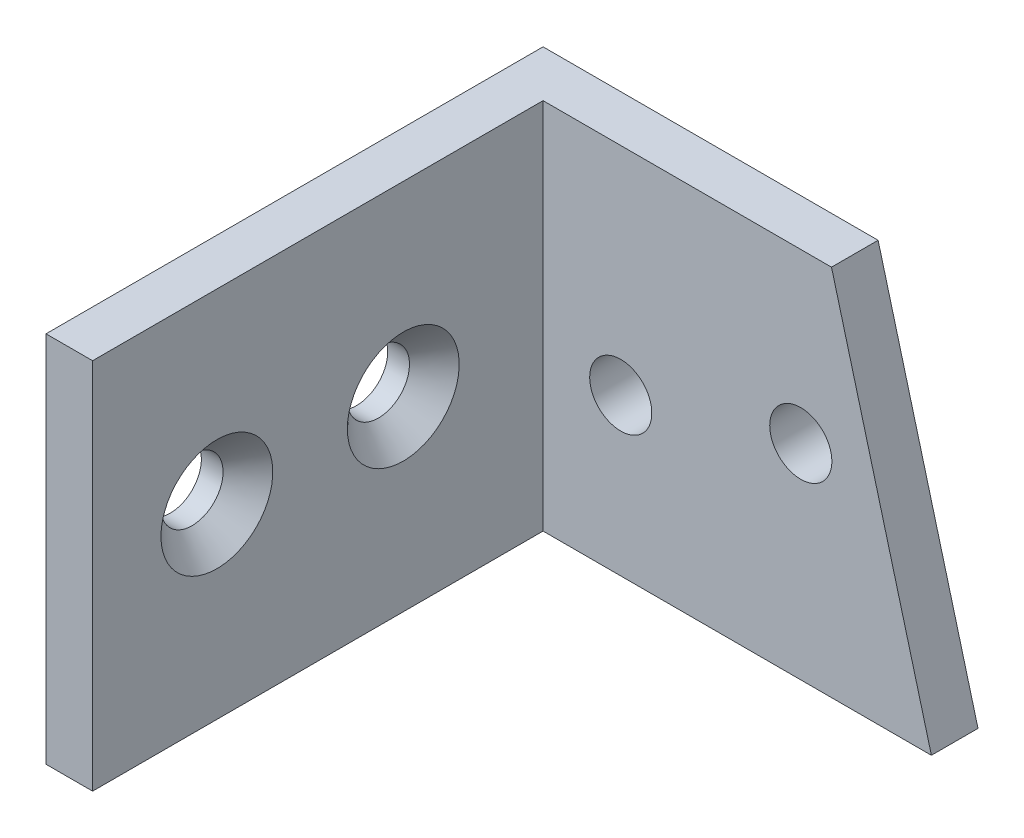
ISO-10303-21;
HEADER;
FILE_DESCRIPTION(('STEP AP214'),'2;1');
FILE_NAME('part.step','',(''),(''),'','','');
FILE_SCHEMA(('AUTOMOTIVE_DESIGN { 1 0 10303 214 1 1 1 1 }'));
ENDSEC;
DATA;
#1=APPLICATION_CONTEXT('core data for automotive mechanical design processes');
#2=APPLICATION_PROTOCOL_DEFINITION('international standard','automotive_design',2000,#1);
#3=PRODUCT_CONTEXT('',#1,'mechanical');
#4=PRODUCT('Part','Part','',(#3));
#5=PRODUCT_RELATED_PRODUCT_CATEGORY('part','',(#4));
#6=PRODUCT_DEFINITION_FORMATION('','',#4);
#7=PRODUCT_DEFINITION_CONTEXT('part definition',#1,'design');
#8=PRODUCT_DEFINITION('design','',#6,#7);
#9=PRODUCT_DEFINITION_SHAPE('','',#8);
#10=(LENGTH_UNIT() NAMED_UNIT(*) SI_UNIT(.MILLI.,.METRE.));
#11=(NAMED_UNIT(*) PLANE_ANGLE_UNIT() SI_UNIT($,.RADIAN.));
#12=(NAMED_UNIT(*) SI_UNIT($,.STERADIAN.) SOLID_ANGLE_UNIT());
#13=UNCERTAINTY_MEASURE_WITH_UNIT(LENGTH_MEASURE(1.E-05),#10,'distance_accuracy_value','');
#14=(GEOMETRIC_REPRESENTATION_CONTEXT(3) GLOBAL_UNCERTAINTY_ASSIGNED_CONTEXT((#13)) GLOBAL_UNIT_ASSIGNED_CONTEXT((#10,
#11,#12)) REPRESENTATION_CONTEXT('',''));
#15=CARTESIAN_POINT('',(0.,0.,0.));
#16=DIRECTION('',(0.,0.,1.));
#17=DIRECTION('',(1.,0.,0.));
#18=AXIS2_PLACEMENT_3D('',#15,#16,#17);
#19=CARTESIAN_POINT('',(-4.7625,38.1,0.));
#20=DIRECTION('',(0.,0.,-1.));
#21=DIRECTION('',(-1.,0.,0.));
#22=AXIS2_PLACEMENT_3D('',#19,#20,#21);
#23=PLANE('',#22);
#24=DIRECTION('',(1.,0.,0.));
#25=VECTOR('',#24,1.);
#26=CARTESIAN_POINT('',(-4.7625,0.,0.));
#27=LINE('',#26,#25);
#28=CARTESIAN_POINT('',(-4.7625,0.,0.));
#29=VERTEX_POINT('',#28);
#30=CARTESIAN_POINT('',(0.,0.,0.));
#31=VERTEX_POINT('',#30);
#32=EDGE_CURVE('E172',#29,#31,#27,.T.);
#33=ORIENTED_EDGE('',*,*,#32,.T.);
#34=DIRECTION('',(0.,-1.,0.));
#35=VECTOR('',#34,1.);
#36=CARTESIAN_POINT('',(0.,38.1,0.));
#37=LINE('',#36,#35);
#38=CARTESIAN_POINT('',(0.,38.1,0.));
#39=VERTEX_POINT('',#38);
#40=EDGE_CURVE('E125',#39,#31,#37,.T.);
#41=ORIENTED_EDGE('',*,*,#40,.F.);
#42=DIRECTION('',(1.,0.,0.));
#43=VECTOR('',#42,1.);
#44=CARTESIAN_POINT('',(-4.7625,38.1,0.));
#45=LINE('',#44,#43);
#46=CARTESIAN_POINT('',(-4.7625,38.1,0.));
#47=VERTEX_POINT('',#46);
#48=EDGE_CURVE('E115',#47,#39,#45,.T.);
#49=ORIENTED_EDGE('',*,*,#48,.F.);
#50=DIRECTION('',(0.,-1.,0.));
#51=VECTOR('',#50,1.);
#52=CARTESIAN_POINT('',(-4.7625,38.1,0.));
#53=LINE('',#52,#51);
#54=EDGE_CURVE('E116',#47,#29,#53,.T.);
#55=ORIENTED_EDGE('',*,*,#54,.T.);
#56=EDGE_LOOP('',(#33,#41,#49,#55));
#57=FACE_BOUND('',#56,.T.);
#58=ADVANCED_FACE('F35',(#57),#23,.F.);
#59=CARTESIAN_POINT('',(0.,38.1,0.));
#60=DIRECTION('',(-1.,0.,0.));
#61=DIRECTION('',(0.,0.,1.));
#62=AXIS2_PLACEMENT_3D('',#59,#60,#61);
#63=PLANE('',#62);
#64=CARTESIAN_POINT('',(0.,19.05,-12.7));
#65=DIRECTION('',(-1.,0.,0.));
#66=DIRECTION('',(0.,0.,1.));
#67=AXIS2_PLACEMENT_3D('',#64,#65,#66);
#68=CIRCLE('',#67,5.715);
#69=CARTESIAN_POINT('',(0.,19.05,-6.985));
#70=VERTEX_POINT('',#69);
#71=EDGE_CURVE('E43',#70,#70,#68,.T.);
#72=ORIENTED_EDGE('',*,*,#71,.T.);
#73=EDGE_LOOP('',(#72));
#74=FACE_BOUND('',#73,.T.);
#75=CARTESIAN_POINT('',(0.,19.05,-31.75));
#76=DIRECTION('',(-1.,0.,0.));
#77=DIRECTION('',(0.,0.,1.));
#78=AXIS2_PLACEMENT_3D('',#75,#76,#77);
#79=CIRCLE('',#78,5.71500000000001);
#80=CARTESIAN_POINT('',(0.,19.05,-26.035));
#81=VERTEX_POINT('',#80);
#82=EDGE_CURVE('E131',#81,#81,#79,.T.);
#83=ORIENTED_EDGE('',*,*,#82,.T.);
#84=EDGE_LOOP('',(#83));
#85=FACE_BOUND('',#84,.T.);
#86=DIRECTION('',(0.,0.,-1.));
#87=VECTOR('',#86,1.);
#88=CARTESIAN_POINT('',(0.,0.,0.));
#89=LINE('',#88,#87);
#90=CARTESIAN_POINT('',(0.,0.,-46.0375));
#91=VERTEX_POINT('',#90);
#92=EDGE_CURVE('E110',#31,#91,#89,.T.);
#93=ORIENTED_EDGE('',*,*,#92,.T.);
#94=DIRECTION('',(0.,-1.,0.));
#95=VECTOR('',#94,1.);
#96=CARTESIAN_POINT('',(0.,38.1,-46.0375));
#97=LINE('',#96,#95);
#98=CARTESIAN_POINT('',(0.,38.1,-46.0375));
#99=VERTEX_POINT('',#98);
#100=EDGE_CURVE('E122',#99,#91,#97,.T.);
#101=ORIENTED_EDGE('',*,*,#100,.F.);
#102=DIRECTION('',(0.,0.,-1.));
#103=VECTOR('',#102,1.);
#104=CARTESIAN_POINT('',(0.,38.1,0.));
#105=LINE('',#104,#103);
#106=EDGE_CURVE('E175',#39,#99,#105,.T.);
#107=ORIENTED_EDGE('',*,*,#106,.F.);
#108=ORIENTED_EDGE('',*,*,#40,.T.);
#109=EDGE_LOOP('',(#93,#101,#107,#108));
#110=FACE_BOUND('',#109,.T.);
#111=ADVANCED_FACE('F136',(#74,#85,#110),#63,.F.);
#112=CARTESIAN_POINT('',(0.,38.1,-46.0375));
#113=DIRECTION('',(0.,0.,-1.));
#114=DIRECTION('',(-1.,0.,0.));
#115=AXIS2_PLACEMENT_3D('',#112,#113,#114);
#116=PLANE('',#115);
#117=CARTESIAN_POINT('',(7.93749999999999,15.9964155109793,-46.0375));
#118=DIRECTION('',(0.,0.,-1.));
#119=DIRECTION('',(-1.,0.,0.));
#120=AXIS2_PLACEMENT_3D('',#117,#118,#119);
#121=CIRCLE('',#120,3.175);
#122=CARTESIAN_POINT('',(4.76249999999999,15.9964155109793,-46.0375));
#123=VERTEX_POINT('',#122);
#124=EDGE_CURVE('E158',#123,#123,#121,.T.);
#125=ORIENTED_EDGE('',*,*,#124,.T.);
#126=EDGE_LOOP('',(#125));
#127=FACE_BOUND('',#126,.T.);
#128=CARTESIAN_POINT('',(26.3383869908067,20.9269183201823,-46.0375));
#129=DIRECTION('',(0.,0.,-1.));
#130=DIRECTION('',(-1.,0.,0.));
#131=AXIS2_PLACEMENT_3D('',#128,#129,#130);
#132=CIRCLE('',#131,3.175);
#133=CARTESIAN_POINT('',(23.1633869908067,20.9269183201823,-46.0375));
#134=VERTEX_POINT('',#133);
#135=EDGE_CURVE('E169',#134,#134,#132,.T.);
#136=ORIENTED_EDGE('',*,*,#135,.T.);
#137=EDGE_LOOP('',(#136));
#138=FACE_BOUND('',#137,.T.);
#139=DIRECTION('',(1.,0.,0.));
#140=VECTOR('',#139,1.);
#141=CARTESIAN_POINT('',(0.,0.,-46.0375));
#142=LINE('',#141,#140);
#143=CARTESIAN_POINT('',(39.6875,0.,-46.0375));
#144=VERTEX_POINT('',#143);
#145=EDGE_CURVE('E108',#91,#144,#142,.T.);
#146=ORIENTED_EDGE('',*,*,#145,.T.);
#147=DIRECTION('',(-0.258819045102521,0.965925826289068,0.));
#148=VECTOR('',#147,1.);
#149=CARTESIAN_POINT('',(27.5039416063474,45.4696589420936,-46.0375));
#150=LINE('',#149,#148);
#151=CARTESIAN_POINT('',(29.4786357683742,38.1,-46.0375));
#152=VERTEX_POINT('',#151);
#153=EDGE_CURVE('E58',#144,#152,#150,.T.);
#154=ORIENTED_EDGE('',*,*,#153,.T.);
#155=DIRECTION('',(1.,0.,0.));
#156=VECTOR('',#155,1.);
#157=CARTESIAN_POINT('',(0.,38.1,-46.0375));
#158=LINE('',#157,#156);
#159=EDGE_CURVE('E177',#99,#152,#158,.T.);
#160=ORIENTED_EDGE('',*,*,#159,.F.);
#161=ORIENTED_EDGE('',*,*,#100,.T.);
#162=EDGE_LOOP('',(#146,#154,#160,#161));
#163=FACE_BOUND('',#162,.T.);
#164=ADVANCED_FACE('F185',(#127,#138,#163),#116,.F.);
#165=CARTESIAN_POINT('',(39.6875,38.1,-50.8));
#166=DIRECTION('',(0.,0.,1.));
#167=DIRECTION('',(1.,0.,0.));
#168=AXIS2_PLACEMENT_3D('',#165,#166,#167);
#169=PLANE('',#168);
#170=CARTESIAN_POINT('',(7.93749999999999,15.9964155109793,-50.8));
#171=DIRECTION('',(0.,0.,-1.));
#172=DIRECTION('',(-1.,0.,0.));
#173=AXIS2_PLACEMENT_3D('',#170,#171,#172);
#174=CIRCLE('',#173,3.175);
#175=CARTESIAN_POINT('',(4.76249999999999,15.9964155109793,-50.8));
#176=VERTEX_POINT('',#175);
#177=EDGE_CURVE('E154',#176,#176,#174,.T.);
#178=ORIENTED_EDGE('',*,*,#177,.F.);
#179=EDGE_LOOP('',(#178));
#180=FACE_BOUND('',#179,.T.);
#181=CARTESIAN_POINT('',(26.3383869908067,20.9269183201823,-50.8));
#182=DIRECTION('',(0.,0.,-1.));
#183=DIRECTION('',(-1.,0.,0.));
#184=AXIS2_PLACEMENT_3D('',#181,#182,#183);
#185=CIRCLE('',#184,3.175);
#186=CARTESIAN_POINT('',(23.1633869908067,20.9269183201823,-50.8));
#187=VERTEX_POINT('',#186);
#188=EDGE_CURVE('E166',#187,#187,#185,.T.);
#189=ORIENTED_EDGE('',*,*,#188,.F.);
#190=EDGE_LOOP('',(#189));
#191=FACE_BOUND('',#190,.T.);
#192=DIRECTION('',(-1.,0.,0.));
#193=VECTOR('',#192,1.);
#194=CARTESIAN_POINT('',(39.6875,38.1,-50.8));
#195=LINE('',#194,#193);
#196=CARTESIAN_POINT('',(29.4786357683742,38.1,-50.8));
#197=VERTEX_POINT('',#196);
#198=CARTESIAN_POINT('',(-4.76250000000001,38.1,-50.8));
#199=VERTEX_POINT('',#198);
#200=EDGE_CURVE('E104',#197,#199,#195,.T.);
#201=ORIENTED_EDGE('',*,*,#200,.F.);
#202=DIRECTION('',(0.258819045102521,-0.965925826289068,0.));
#203=VECTOR('',#202,1.);
#204=CARTESIAN_POINT('',(30.1625,35.5477839420935,-50.8));
#205=LINE('',#204,#203);
#206=CARTESIAN_POINT('',(39.6875,0.,-50.8));
#207=VERTEX_POINT('',#206);
#208=EDGE_CURVE('E102',#197,#207,#205,.T.);
#209=ORIENTED_EDGE('',*,*,#208,.T.);
#210=DIRECTION('',(-1.,0.,0.));
#211=VECTOR('',#210,1.);
#212=CARTESIAN_POINT('',(39.6875,0.,-50.8));
#213=LINE('',#212,#211);
#214=CARTESIAN_POINT('',(-4.76250000000001,0.,-50.8));
#215=VERTEX_POINT('',#214);
#216=EDGE_CURVE('E89',#207,#215,#213,.T.);
#217=ORIENTED_EDGE('',*,*,#216,.T.);
#218=DIRECTION('',(0.,-1.,0.));
#219=VECTOR('',#218,1.);
#220=CARTESIAN_POINT('',(-4.76250000000001,38.1,-50.8));
#221=LINE('',#220,#219);
#222=EDGE_CURVE('E119',#199,#215,#221,.T.);
#223=ORIENTED_EDGE('',*,*,#222,.F.);
#224=EDGE_LOOP('',(#201,#209,#217,#223));
#225=FACE_BOUND('',#224,.T.);
#226=ADVANCED_FACE('F103',(#180,#191,#225),#169,.F.);
#227=CARTESIAN_POINT('',(-4.76250000000001,38.1,-50.8));
#228=DIRECTION('',(1.,0.,0.));
#229=DIRECTION('',(0.,0.,-1.));
#230=AXIS2_PLACEMENT_3D('',#227,#228,#229);
#231=PLANE('',#230);
#232=CARTESIAN_POINT('',(-4.7625,19.05,-31.75));
#233=DIRECTION('',(-1.,0.,0.));
#234=DIRECTION('',(0.,0.,1.));
#235=AXIS2_PLACEMENT_3D('',#232,#233,#234);
#236=CIRCLE('',#235,3.175);
#237=CARTESIAN_POINT('',(-4.7625,19.05,-28.575));
#238=VERTEX_POINT('',#237);
#239=EDGE_CURVE('E155',#238,#238,#236,.T.);
#240=ORIENTED_EDGE('',*,*,#239,.F.);
#241=EDGE_LOOP('',(#240));
#242=FACE_BOUND('',#241,.T.);
#243=CARTESIAN_POINT('',(-4.7625,19.05,-12.7));
#244=DIRECTION('',(-1.,0.,0.));
#245=DIRECTION('',(0.,0.,1.));
#246=AXIS2_PLACEMENT_3D('',#243,#244,#245);
#247=CIRCLE('',#246,3.175);
#248=CARTESIAN_POINT('',(-4.7625,19.05,-9.525));
#249=VERTEX_POINT('',#248);
#250=EDGE_CURVE('E152',#249,#249,#247,.T.);
#251=ORIENTED_EDGE('',*,*,#250,.F.);
#252=EDGE_LOOP('',(#251));
#253=FACE_BOUND('',#252,.T.);
#254=DIRECTION('',(0.,0.,1.));
#255=VECTOR('',#254,1.);
#256=CARTESIAN_POINT('',(-4.76250000000001,0.,-50.8));
#257=LINE('',#256,#255);
#258=EDGE_CURVE('E96',#215,#29,#257,.T.);
#259=ORIENTED_EDGE('',*,*,#258,.T.);
#260=ORIENTED_EDGE('',*,*,#54,.F.);
#261=DIRECTION('',(0.,0.,1.));
#262=VECTOR('',#261,1.);
#263=CARTESIAN_POINT('',(-4.76250000000001,38.1,-50.8));
#264=LINE('',#263,#262);
#265=EDGE_CURVE('E120',#199,#47,#264,.T.);
#266=ORIENTED_EDGE('',*,*,#265,.F.);
#267=ORIENTED_EDGE('',*,*,#222,.T.);
#268=EDGE_LOOP('',(#259,#260,#266,#267));
#269=FACE_BOUND('',#268,.T.);
#270=ADVANCED_FACE('F193',(#242,#253,#269),#231,.F.);
#271=CARTESIAN_POINT('',(0.,38.1,0.));
#272=DIRECTION('',(0.,1.,0.));
#273=DIRECTION('',(0.,0.,1.));
#274=AXIS2_PLACEMENT_3D('',#271,#272,#273);
#275=PLANE('',#274);
#276=DIRECTION('',(0.,0.,1.));
#277=VECTOR('',#276,1.);
#278=CARTESIAN_POINT('',(29.4786357683742,38.1,-211.189535199886));
#279=LINE('',#278,#277);
#280=EDGE_CURVE('E50',#197,#152,#279,.T.);
#281=ORIENTED_EDGE('',*,*,#280,.F.);
#282=ORIENTED_EDGE('',*,*,#200,.T.);
#283=ORIENTED_EDGE('',*,*,#265,.T.);
#284=ORIENTED_EDGE('',*,*,#48,.T.);
#285=ORIENTED_EDGE('',*,*,#106,.T.);
#286=ORIENTED_EDGE('',*,*,#159,.T.);
#287=EDGE_LOOP('',(#281,#282,#283,#284,#285,#286));
#288=FACE_BOUND('',#287,.T.);
#289=ADVANCED_FACE('F186',(#288),#275,.T.);
#290=CARTESIAN_POINT('',(0.,0.,0.));
#291=DIRECTION('',(0.,1.,0.));
#292=DIRECTION('',(0.,0.,1.));
#293=AXIS2_PLACEMENT_3D('',#290,#291,#292);
#294=PLANE('',#293);
#295=ORIENTED_EDGE('',*,*,#32,.F.);
#296=ORIENTED_EDGE('',*,*,#258,.F.);
#297=ORIENTED_EDGE('',*,*,#216,.F.);
#298=DIRECTION('',(0.,0.,-1.));
#299=VECTOR('',#298,1.);
#300=CARTESIAN_POINT('',(39.6875,0.,-46.0375));
#301=LINE('',#300,#299);
#302=EDGE_CURVE('E95',#144,#207,#301,.T.);
#303=ORIENTED_EDGE('',*,*,#302,.F.);
#304=ORIENTED_EDGE('',*,*,#145,.F.);
#305=ORIENTED_EDGE('',*,*,#92,.F.);
#306=EDGE_LOOP('',(#295,#296,#297,#303,#304,#305));
#307=FACE_BOUND('',#306,.T.);
#308=ADVANCED_FACE('F92',(#307),#294,.F.);
#309=CARTESIAN_POINT('',(26.3383869908068,20.9269183201823,-12.7));
#310=DIRECTION('',(0.,0.,-1.));
#311=DIRECTION('',(-1.,0.,0.));
#312=AXIS2_PLACEMENT_3D('',#309,#310,#311);
#313=CYLINDRICAL_SURFACE('',#312,3.175);
#314=CARTESIAN_POINT('',(23.1633869908067,20.9269183201823,-50.8));
#315=CARTESIAN_POINT('',(23.1633869908067,20.9269183201823,-50.750390625));
#316=CARTESIAN_POINT('',(23.1633869908067,20.9269183201823,-50.70078125));
#317=CARTESIAN_POINT('',(23.1633869908067,20.9269183201823,-50.6015625));
#318=CARTESIAN_POINT('',(23.1633869908067,20.9269183201823,-50.551953125));
#319=CARTESIAN_POINT('',(23.1633869908067,20.9269183201823,-50.452734375));
#320=CARTESIAN_POINT('',(23.1633869908067,20.9269183201823,-50.403125));
#321=CARTESIAN_POINT('',(23.1633869908067,20.9269183201823,-50.30390625));
#322=CARTESIAN_POINT('',(23.1633869908067,20.9269183201823,-50.254296875));
#323=CARTESIAN_POINT('',(23.1633869908067,20.9269183201823,-50.155078125));
#324=CARTESIAN_POINT('',(23.1633869908067,20.9269183201823,-50.10546875));
#325=CARTESIAN_POINT('',(23.1633869908067,20.9269183201823,-50.00625));
#326=CARTESIAN_POINT('',(23.1633869908067,20.9269183201823,-49.956640625));
#327=CARTESIAN_POINT('',(23.1633869908067,20.9269183201823,-49.857421875));
#328=CARTESIAN_POINT('',(23.1633869908067,20.9269183201823,-49.8078125));
#329=CARTESIAN_POINT('',(23.1633869908067,20.9269183201823,-49.70859375));
#330=CARTESIAN_POINT('',(23.1633869908067,20.9269183201823,-49.658984375));
#331=CARTESIAN_POINT('',(23.1633869908067,20.9269183201823,-49.559765625));
#332=CARTESIAN_POINT('',(23.1633869908067,20.9269183201823,-49.51015625));
#333=CARTESIAN_POINT('',(23.1633869908067,20.9269183201823,-49.4109375));
#334=CARTESIAN_POINT('',(23.1633869908067,20.9269183201823,-49.361328125));
#335=CARTESIAN_POINT('',(23.1633869908067,20.9269183201823,-49.262109375));
#336=CARTESIAN_POINT('',(23.1633869908067,20.9269183201823,-49.2125));
#337=CARTESIAN_POINT('',(23.1633869908067,20.9269183201823,-49.11328125));
#338=CARTESIAN_POINT('',(23.1633869908067,20.9269183201823,-49.063671875));
#339=CARTESIAN_POINT('',(23.1633869908067,20.9269183201823,-48.964453125));
#340=CARTESIAN_POINT('',(23.1633869908067,20.9269183201823,-48.91484375));
#341=CARTESIAN_POINT('',(23.1633869908067,20.9269183201823,-48.815625));
#342=CARTESIAN_POINT('',(23.1633869908067,20.9269183201823,-48.766015625));
#343=CARTESIAN_POINT('',(23.1633869908067,20.9269183201823,-48.666796875));
#344=CARTESIAN_POINT('',(23.1633869908067,20.9269183201823,-48.6171875));
#345=CARTESIAN_POINT('',(23.1633869908067,20.9269183201823,-48.51796875));
#346=CARTESIAN_POINT('',(23.1633869908067,20.9269183201823,-48.468359375));
#347=CARTESIAN_POINT('',(23.1633869908067,20.9269183201823,-48.369140625));
#348=CARTESIAN_POINT('',(23.1633869908067,20.9269183201823,-48.31953125));
#349=CARTESIAN_POINT('',(23.1633869908067,20.9269183201823,-48.2203125));
#350=CARTESIAN_POINT('',(23.1633869908067,20.9269183201823,-48.170703125));
#351=CARTESIAN_POINT('',(23.1633869908067,20.9269183201823,-48.071484375));
#352=CARTESIAN_POINT('',(23.1633869908067,20.9269183201823,-48.021875));
#353=CARTESIAN_POINT('',(23.1633869908067,20.9269183201823,-47.92265625));
#354=CARTESIAN_POINT('',(23.1633869908067,20.9269183201823,-47.873046875));
#355=CARTESIAN_POINT('',(23.1633869908067,20.9269183201823,-47.773828125));
#356=CARTESIAN_POINT('',(23.1633869908067,20.9269183201823,-47.72421875));
#357=CARTESIAN_POINT('',(23.1633869908067,20.9269183201823,-47.625));
#358=CARTESIAN_POINT('',(23.1633869908067,20.9269183201823,-47.575390625));
#359=CARTESIAN_POINT('',(23.1633869908067,20.9269183201823,-47.476171875));
#360=CARTESIAN_POINT('',(23.1633869908067,20.9269183201823,-47.4265625));
#361=CARTESIAN_POINT('',(23.1633869908067,20.9269183201823,-47.32734375));
#362=CARTESIAN_POINT('',(23.1633869908067,20.9269183201823,-47.277734375));
#363=CARTESIAN_POINT('',(23.1633869908067,20.9269183201823,-47.178515625));
#364=CARTESIAN_POINT('',(23.1633869908067,20.9269183201823,-47.12890625));
#365=CARTESIAN_POINT('',(23.1633869908067,20.9269183201823,-47.0296875));
#366=CARTESIAN_POINT('',(23.1633869908067,20.9269183201823,-46.980078125));
#367=CARTESIAN_POINT('',(23.1633869908067,20.9269183201823,-46.880859375));
#368=CARTESIAN_POINT('',(23.1633869908067,20.9269183201823,-46.83125));
#369=CARTESIAN_POINT('',(23.1633869908067,20.9269183201823,-46.73203125));
#370=CARTESIAN_POINT('',(23.1633869908067,20.9269183201823,-46.682421875));
#371=CARTESIAN_POINT('',(23.1633869908067,20.9269183201823,-46.583203125));
#372=CARTESIAN_POINT('',(23.1633869908067,20.9269183201823,-46.53359375));
#373=CARTESIAN_POINT('',(23.1633869908067,20.9269183201823,-46.434375));
#374=CARTESIAN_POINT('',(23.1633869908067,20.9269183201823,-46.384765625));
#375=CARTESIAN_POINT('',(23.1633869908067,20.9269183201823,-46.285546875));
#376=CARTESIAN_POINT('',(23.1633869908067,20.9269183201823,-46.2359375));
#377=CARTESIAN_POINT('',(23.1633869908067,20.9269183201823,-46.13671875));
#378=CARTESIAN_POINT('',(23.1633869908067,20.9269183201823,-46.087109375));
#379=CARTESIAN_POINT('',(23.1633869908067,20.9269183201823,-46.0375));
#380=B_SPLINE_CURVE_WITH_KNOTS('',3,(#314,#315,#316,#317,#318,#319,#320,#321,#322,#323,#324,
#325,#326,#327,#328,#329,#330,#331,#332,#333,#334,#335,#336,#337,#338,#339,#340,#341,#342,#343,
#344,#345,#346,#347,#348,#349,#350,#351,#352,#353,#354,#355,#356,#357,#358,#359,#360,#361,#362,
#363,#364,#365,#366,#367,#368,#369,#370,#371,#372,#373,#374,#375,#376,#377,#378,#379),
.UNSPECIFIED.,.F.,.F.,(4,2,2,2,2,2,2,2,2,2,2,2,2,2,2,2,2,2,2,2,2,2,2,2,2,2,2,2,2,2,2,2,4),(0.,
0.148828125,0.29765625,0.446484375,0.5953125,0.744140625,0.892968750000001,1.041796875,1.190625,
1.33945312500001,1.48828125000001,1.63710937500001,1.78593750000001,1.93476562500001,
2.08359375000001,2.23242187500001,2.38125000000001,2.53007812500001,2.67890625000001,
2.82773437500001,2.97656250000001,3.12539062500001,3.27421875000001,3.42304687500001,
3.57187500000002,3.72070312500002,3.86953125000002,4.01835937500002,4.16718750000002,
4.31601562500002,4.46484375000002,4.61367187500002,4.76250000000002),.UNSPECIFIED.);
#381=EDGE_CURVE('BSEAM221',#187,#134,#380,.T.);
#382=ORIENTED_EDGE('',*,*,#188,.T.);
#383=ORIENTED_EDGE('',*,*,#135,.F.);
#384=ORIENTED_EDGE('',*,*,#381,.T.);
#385=ORIENTED_EDGE('',*,*,#381,.F.);
#386=EDGE_LOOP('',(#382,#384,#383,#385));
#387=FACE_BOUND('',#386,.T.);
#388=ADVANCED_FACE('F221',(#387),#313,.F.);
#389=CARTESIAN_POINT('',(7.9375,15.9964155109793,-12.7));
#390=DIRECTION('',(0.,0.,-1.));
#391=DIRECTION('',(-1.,0.,0.));
#392=AXIS2_PLACEMENT_3D('',#389,#390,#391);
#393=CYLINDRICAL_SURFACE('',#392,3.175);
#394=CARTESIAN_POINT('',(4.76249999999999,15.9964155109793,-50.8));
#395=CARTESIAN_POINT('',(4.76249999999999,15.9964155109793,-50.750390625));
#396=CARTESIAN_POINT('',(4.76249999999999,15.9964155109793,-50.70078125));
#397=CARTESIAN_POINT('',(4.76249999999999,15.9964155109793,-50.6015625));
#398=CARTESIAN_POINT('',(4.76249999999999,15.9964155109793,-50.551953125));
#399=CARTESIAN_POINT('',(4.76249999999999,15.9964155109793,-50.452734375));
#400=CARTESIAN_POINT('',(4.76249999999999,15.9964155109793,-50.403125));
#401=CARTESIAN_POINT('',(4.76249999999999,15.9964155109793,-50.30390625));
#402=CARTESIAN_POINT('',(4.76249999999999,15.9964155109793,-50.254296875));
#403=CARTESIAN_POINT('',(4.76249999999999,15.9964155109793,-50.155078125));
#404=CARTESIAN_POINT('',(4.76249999999999,15.9964155109793,-50.10546875));
#405=CARTESIAN_POINT('',(4.76249999999999,15.9964155109793,-50.00625));
#406=CARTESIAN_POINT('',(4.76249999999999,15.9964155109793,-49.956640625));
#407=CARTESIAN_POINT('',(4.76249999999999,15.9964155109793,-49.857421875));
#408=CARTESIAN_POINT('',(4.76249999999999,15.9964155109793,-49.8078125));
#409=CARTESIAN_POINT('',(4.76249999999999,15.9964155109793,-49.70859375));
#410=CARTESIAN_POINT('',(4.76249999999999,15.9964155109793,-49.658984375));
#411=CARTESIAN_POINT('',(4.76249999999999,15.9964155109793,-49.559765625));
#412=CARTESIAN_POINT('',(4.76249999999999,15.9964155109793,-49.51015625));
#413=CARTESIAN_POINT('',(4.76249999999999,15.9964155109793,-49.4109375));
#414=CARTESIAN_POINT('',(4.76249999999999,15.9964155109793,-49.361328125));
#415=CARTESIAN_POINT('',(4.76249999999999,15.9964155109793,-49.262109375));
#416=CARTESIAN_POINT('',(4.76249999999999,15.9964155109793,-49.2125));
#417=CARTESIAN_POINT('',(4.76249999999999,15.9964155109793,-49.11328125));
#418=CARTESIAN_POINT('',(4.76249999999999,15.9964155109793,-49.063671875));
#419=CARTESIAN_POINT('',(4.76249999999999,15.9964155109793,-48.964453125));
#420=CARTESIAN_POINT('',(4.76249999999999,15.9964155109793,-48.91484375));
#421=CARTESIAN_POINT('',(4.76249999999999,15.9964155109793,-48.815625));
#422=CARTESIAN_POINT('',(4.76249999999999,15.9964155109793,-48.766015625));
#423=CARTESIAN_POINT('',(4.76249999999999,15.9964155109793,-48.666796875));
#424=CARTESIAN_POINT('',(4.76249999999999,15.9964155109793,-48.6171875));
#425=CARTESIAN_POINT('',(4.76249999999999,15.9964155109793,-48.51796875));
#426=CARTESIAN_POINT('',(4.76249999999999,15.9964155109793,-48.468359375));
#427=CARTESIAN_POINT('',(4.76249999999999,15.9964155109793,-48.369140625));
#428=CARTESIAN_POINT('',(4.76249999999999,15.9964155109793,-48.31953125));
#429=CARTESIAN_POINT('',(4.76249999999999,15.9964155109793,-48.2203125));
#430=CARTESIAN_POINT('',(4.76249999999999,15.9964155109793,-48.170703125));
#431=CARTESIAN_POINT('',(4.76249999999999,15.9964155109793,-48.071484375));
#432=CARTESIAN_POINT('',(4.76249999999999,15.9964155109793,-48.021875));
#433=CARTESIAN_POINT('',(4.76249999999999,15.9964155109793,-47.92265625));
#434=CARTESIAN_POINT('',(4.76249999999999,15.9964155109793,-47.873046875));
#435=CARTESIAN_POINT('',(4.76249999999999,15.9964155109793,-47.773828125));
#436=CARTESIAN_POINT('',(4.76249999999999,15.9964155109793,-47.72421875));
#437=CARTESIAN_POINT('',(4.76249999999999,15.9964155109793,-47.625));
#438=CARTESIAN_POINT('',(4.76249999999999,15.9964155109793,-47.575390625));
#439=CARTESIAN_POINT('',(4.76249999999999,15.9964155109793,-47.476171875));
#440=CARTESIAN_POINT('',(4.76249999999999,15.9964155109793,-47.4265625));
#441=CARTESIAN_POINT('',(4.76249999999999,15.9964155109793,-47.32734375));
#442=CARTESIAN_POINT('',(4.76249999999999,15.9964155109793,-47.277734375));
#443=CARTESIAN_POINT('',(4.76249999999999,15.9964155109793,-47.178515625));
#444=CARTESIAN_POINT('',(4.76249999999999,15.9964155109793,-47.12890625));
#445=CARTESIAN_POINT('',(4.76249999999999,15.9964155109793,-47.0296875));
#446=CARTESIAN_POINT('',(4.76249999999999,15.9964155109793,-46.980078125));
#447=CARTESIAN_POINT('',(4.76249999999999,15.9964155109793,-46.880859375));
#448=CARTESIAN_POINT('',(4.76249999999999,15.9964155109793,-46.83125));
#449=CARTESIAN_POINT('',(4.76249999999999,15.9964155109793,-46.73203125));
#450=CARTESIAN_POINT('',(4.76249999999999,15.9964155109793,-46.682421875));
#451=CARTESIAN_POINT('',(4.76249999999999,15.9964155109793,-46.583203125));
#452=CARTESIAN_POINT('',(4.76249999999999,15.9964155109793,-46.53359375));
#453=CARTESIAN_POINT('',(4.76249999999999,15.9964155109793,-46.434375));
#454=CARTESIAN_POINT('',(4.76249999999999,15.9964155109793,-46.384765625));
#455=CARTESIAN_POINT('',(4.76249999999999,15.9964155109793,-46.285546875));
#456=CARTESIAN_POINT('',(4.76249999999999,15.9964155109793,-46.2359375));
#457=CARTESIAN_POINT('',(4.76249999999999,15.9964155109793,-46.13671875));
#458=CARTESIAN_POINT('',(4.76249999999999,15.9964155109793,-46.087109375));
#459=CARTESIAN_POINT('',(4.76249999999999,15.9964155109793,-46.0375));
#460=B_SPLINE_CURVE_WITH_KNOTS('',3,(#394,#395,#396,#397,#398,#399,#400,#401,#402,#403,#404,
#405,#406,#407,#408,#409,#410,#411,#412,#413,#414,#415,#416,#417,#418,#419,#420,#421,#422,#423,
#424,#425,#426,#427,#428,#429,#430,#431,#432,#433,#434,#435,#436,#437,#438,#439,#440,#441,#442,
#443,#444,#445,#446,#447,#448,#449,#450,#451,#452,#453,#454,#455,#456,#457,#458,#459),
.UNSPECIFIED.,.F.,.F.,(4,2,2,2,2,2,2,2,2,2,2,2,2,2,2,2,2,2,2,2,2,2,2,2,2,2,2,2,2,2,2,2,4),(0.,
0.148828125,0.29765625,0.446484375,0.5953125,0.744140625,0.892968750000001,1.041796875,1.190625,
1.339453125,1.48828125,1.637109375,1.7859375,1.934765625,2.08359375,2.232421875,2.38125,
2.530078125,2.67890625,2.827734375,2.9765625,3.125390625,3.27421875,3.423046875,3.571875,
3.720703125,3.86953125,4.018359375,4.1671875,4.316015625,4.46484375,4.613671875,4.7625),.UNSPECIFIED.);
#461=EDGE_CURVE('BSEAM148',#176,#123,#460,.T.);
#462=ORIENTED_EDGE('',*,*,#177,.T.);
#463=ORIENTED_EDGE('',*,*,#124,.F.);
#464=ORIENTED_EDGE('',*,*,#461,.T.);
#465=ORIENTED_EDGE('',*,*,#461,.F.);
#466=EDGE_LOOP('',(#462,#464,#463,#465));
#467=FACE_BOUND('',#466,.T.);
#468=ADVANCED_FACE('F148',(#467),#393,.F.);
#469=CARTESIAN_POINT('',(39.6885,19.05,-12.7));
#470=DIRECTION('',(-1.,0.,0.));
#471=DIRECTION('',(0.,0.,1.));
#472=AXIS2_PLACEMENT_3D('',#469,#470,#471);
#473=CYLINDRICAL_SURFACE('',#472,3.175);
#474=CARTESIAN_POINT('',(-2.53999999999999,19.05,-12.7));
#475=DIRECTION('',(-1.,0.,0.));
#476=DIRECTION('',(0.,0.,1.));
#477=AXIS2_PLACEMENT_3D('',#474,#475,#476);
#478=CIRCLE('',#477,3.175);
#479=CARTESIAN_POINT('',(-2.53999999999999,19.05,-9.525));
#480=VERTEX_POINT('',#479);
#481=EDGE_CURVE('E128',#480,#480,#478,.F.);
#482=ORIENTED_EDGE('',*,*,#481,.T.);
#483=EDGE_LOOP('',(#482));
#484=FACE_BOUND('',#483,.T.);
#485=ORIENTED_EDGE('',*,*,#250,.T.);
#486=EDGE_LOOP('',(#485));
#487=FACE_BOUND('',#486,.T.);
#488=ADVANCED_FACE('F144',(#484,#487),#473,.F.);
#489=CARTESIAN_POINT('',(39.6885,19.05,-31.75));
#490=DIRECTION('',(-1.,0.,0.));
#491=DIRECTION('',(0.,0.,1.));
#492=AXIS2_PLACEMENT_3D('',#489,#490,#491);
#493=CYLINDRICAL_SURFACE('',#492,3.175);
#494=CARTESIAN_POINT('',(-2.53999999999999,19.05,-31.75));
#495=DIRECTION('',(-1.,0.,0.));
#496=DIRECTION('',(0.,0.,1.));
#497=AXIS2_PLACEMENT_3D('',#494,#495,#496);
#498=CIRCLE('',#497,3.175);
#499=CARTESIAN_POINT('',(-2.53999999999999,19.05,-28.575));
#500=VERTEX_POINT('',#499);
#501=EDGE_CURVE('E11',#500,#500,#498,.F.);
#502=ORIENTED_EDGE('',*,*,#501,.T.);
#503=EDGE_LOOP('',(#502));
#504=FACE_BOUND('',#503,.T.);
#505=ORIENTED_EDGE('',*,*,#239,.T.);
#506=EDGE_LOOP('',(#505));
#507=FACE_BOUND('',#506,.T.);
#508=ADVANCED_FACE('F147',(#504,#507),#493,.F.);
#509=CARTESIAN_POINT('',(29.4786357683742,38.1,-211.189535199886));
#510=DIRECTION('',(-0.965925826289068,-0.258819045102521,0.));
#511=DIRECTION('',(0.258819045102521,-0.965925826289068,0.));
#512=AXIS2_PLACEMENT_3D('',#509,#510,#511);
#513=PLANE('',#512);
#514=ORIENTED_EDGE('',*,*,#153,.F.);
#515=ORIENTED_EDGE('',*,*,#302,.T.);
#516=ORIENTED_EDGE('',*,*,#208,.F.);
#517=ORIENTED_EDGE('',*,*,#280,.T.);
#518=EDGE_LOOP('',(#514,#515,#516,#517));
#519=FACE_BOUND('',#518,.T.);
#520=ADVANCED_FACE('F107',(#519),#513,.F.);
#521=CARTESIAN_POINT('',(-2.53999999999999,19.05,-12.7));
#522=DIRECTION('',(1.,0.,0.));
#523=DIRECTION('',(0.,0.,-1.));
#524=AXIS2_PLACEMENT_3D('',#521,#522,#523);
#525=CONICAL_SURFACE('',#524,3.175,0.78539816339745);
#526=ORIENTED_EDGE('',*,*,#71,.F.);
#527=EDGE_LOOP('',(#526));
#528=FACE_BOUND('',#527,.T.);
#529=ORIENTED_EDGE('',*,*,#481,.F.);
#530=EDGE_LOOP('',(#529));
#531=FACE_BOUND('',#530,.T.);
#532=ADVANCED_FACE('F139',(#528,#531),#525,.F.);
#533=CARTESIAN_POINT('',(-2.53999999999999,19.05,-31.75));
#534=DIRECTION('',(1.,0.,0.));
#535=DIRECTION('',(0.,0.,-1.));
#536=AXIS2_PLACEMENT_3D('',#533,#534,#535);
#537=CONICAL_SURFACE('',#536,3.175,0.785398163397452);
#538=ORIENTED_EDGE('',*,*,#82,.F.);
#539=EDGE_LOOP('',(#538));
#540=FACE_BOUND('',#539,.T.);
#541=ORIENTED_EDGE('',*,*,#501,.F.);
#542=EDGE_LOOP('',(#541));
#543=FACE_BOUND('',#542,.T.);
#544=ADVANCED_FACE('F37',(#540,#543),#537,.F.);
#545=CLOSED_SHELL('',(#58,#111,#164,#226,#270,#289,#308,#388,#468,#488,#508,#520,#532,#544));
#546=MANIFOLD_SOLID_BREP('B2',#545);
#547=ADVANCED_BREP_SHAPE_REPRESENTATION('',(#18,#546),#14);
#548=SHAPE_DEFINITION_REPRESENTATION(#9,#547);
ENDSEC;
END-ISO-10303-21;
